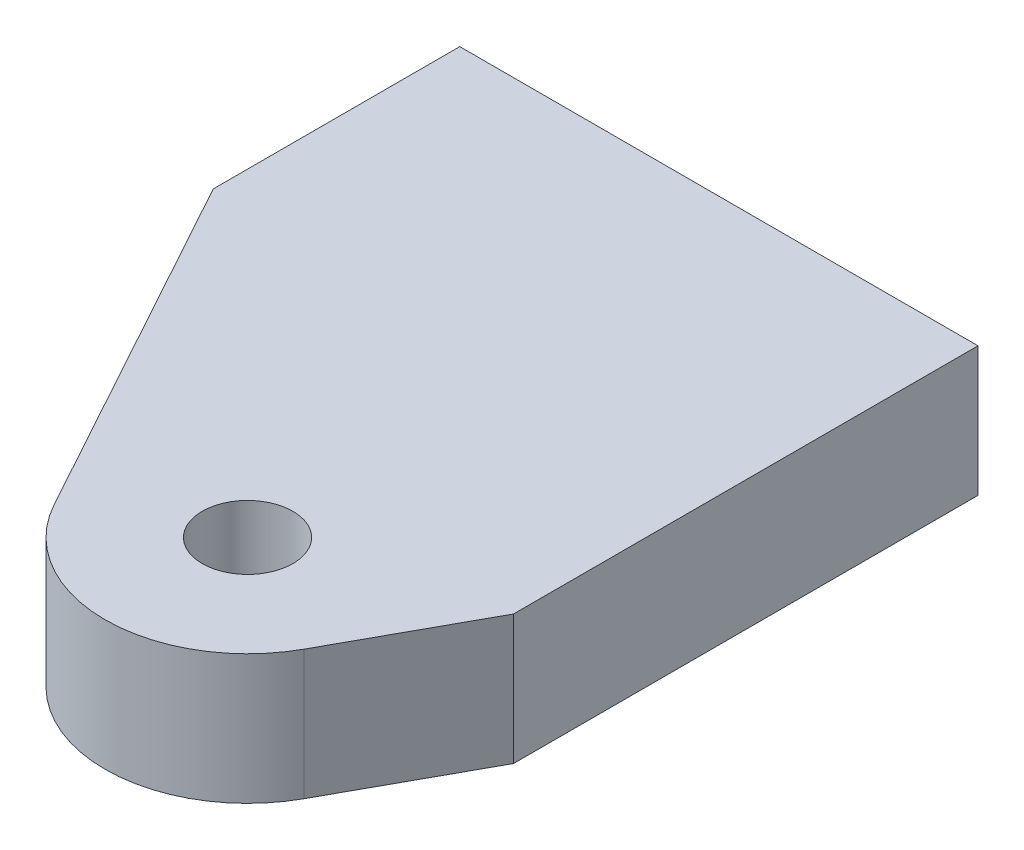
ISO-10303-21;
HEADER;
FILE_DESCRIPTION(('STEP AP214'),'2;1');
FILE_NAME('part.step','',(''),(''),'','','');
FILE_SCHEMA(('AUTOMOTIVE_DESIGN { 1 0 10303 214 1 1 1 1 }'));
ENDSEC;
DATA;
#1=APPLICATION_CONTEXT('core data for automotive mechanical design processes');
#2=APPLICATION_PROTOCOL_DEFINITION('international standard','automotive_design',2000,#1);
#3=PRODUCT_CONTEXT('',#1,'mechanical');
#4=PRODUCT('Part','Part','',(#3));
#5=PRODUCT_RELATED_PRODUCT_CATEGORY('part','',(#4));
#6=PRODUCT_DEFINITION_FORMATION('','',#4);
#7=PRODUCT_DEFINITION_CONTEXT('part definition',#1,'design');
#8=PRODUCT_DEFINITION('design','',#6,#7);
#9=PRODUCT_DEFINITION_SHAPE('','',#8);
#10=(LENGTH_UNIT() NAMED_UNIT(*) SI_UNIT(.MILLI.,.METRE.));
#11=(NAMED_UNIT(*) PLANE_ANGLE_UNIT() SI_UNIT($,.RADIAN.));
#12=(NAMED_UNIT(*) SI_UNIT($,.STERADIAN.) SOLID_ANGLE_UNIT());
#13=UNCERTAINTY_MEASURE_WITH_UNIT(LENGTH_MEASURE(1.E-05),#10,'distance_accuracy_value','');
#14=(GEOMETRIC_REPRESENTATION_CONTEXT(3) GLOBAL_UNCERTAINTY_ASSIGNED_CONTEXT((#13)) GLOBAL_UNIT_ASSIGNED_CONTEXT((#10,
#11,#12)) REPRESENTATION_CONTEXT('',''));
#15=CARTESIAN_POINT('',(0.,0.,0.));
#16=DIRECTION('',(0.,0.,1.));
#17=DIRECTION('',(1.,0.,0.));
#18=AXIS2_PLACEMENT_3D('',#15,#16,#17);
#19=CARTESIAN_POINT('',(2.31000000000003,5.,20.5));
#20=DIRECTION('',(0.,1.,0.));
#21=DIRECTION('',(0.,0.,1.));
#22=AXIS2_PLACEMENT_3D('',#19,#20,#21);
#23=PLANE('',#22);
#24=DIRECTION('',(0.,0.,1.));
#25=VECTOR('',#24,1.);
#26=CARTESIAN_POINT('',(-10.,5.,0.));
#27=LINE('',#26,#25);
#28=CARTESIAN_POINT('',(-10.,5.,0.));
#29=VERTEX_POINT('',#28);
#30=CARTESIAN_POINT('',(-10.,5.,9.51354382946377));
#31=VERTEX_POINT('',#30);
#32=EDGE_CURVE('E129',#29,#31,#27,.T.);
#33=ORIENTED_EDGE('',*,*,#32,.T.);
#34=DIRECTION('',(0.481447756021336,0.,0.876474790408726));
#35=VECTOR('',#34,1.);
#36=CARTESIAN_POINT('',(-10.,5.,9.51354382946377));
#37=LINE('',#36,#35);
#38=CARTESIAN_POINT('',(-2.51061134724796,5.,23.1479626581174));
#39=VERTEX_POINT('',#38);
#40=EDGE_CURVE('E87',#31,#39,#37,.T.);
#41=ORIENTED_EDGE('',*,*,#40,.T.);
#42=CARTESIAN_POINT('',(2.31000000000003,5.,20.5));
#43=DIRECTION('',(0.,1.,0.));
#44=DIRECTION('',(0.,0.,1.));
#45=AXIS2_PLACEMENT_3D('',#42,#43,#44);
#46=CIRCLE('',#45,5.5);
#47=CARTESIAN_POINT('',(7.13061134724803,5.,23.1479626581174));
#48=VERTEX_POINT('',#47);
#49=EDGE_CURVE('E100',#39,#48,#46,.T.);
#50=ORIENTED_EDGE('',*,*,#49,.T.);
#51=DIRECTION('',(0.481447756021337,0.,-0.876474790408726));
#52=VECTOR('',#51,1.);
#53=CARTESIAN_POINT('',(7.13061134724803,5.,23.1479626581174));
#54=LINE('',#53,#52);
#55=CARTESIAN_POINT('',(10.,5.,17.9242456783035));
#56=VERTEX_POINT('',#55);
#57=EDGE_CURVE('E94',#48,#56,#54,.T.);
#58=ORIENTED_EDGE('',*,*,#57,.T.);
#59=DIRECTION('',(0.,0.,-1.));
#60=VECTOR('',#59,1.);
#61=CARTESIAN_POINT('',(10.,5.,17.9242456783035));
#62=LINE('',#61,#60);
#63=CARTESIAN_POINT('',(10.,5.,0.));
#64=VERTEX_POINT('',#63);
#65=EDGE_CURVE('E98',#56,#64,#62,.T.);
#66=ORIENTED_EDGE('',*,*,#65,.T.);
#67=DIRECTION('',(-1.,0.,0.));
#68=VECTOR('',#67,1.);
#69=CARTESIAN_POINT('',(-10.,5.,0.));
#70=LINE('',#69,#68);
#71=EDGE_CURVE('E50',#64,#29,#70,.T.);
#72=ORIENTED_EDGE('',*,*,#71,.T.);
#73=EDGE_LOOP('',(#33,#41,#50,#58,#66,#72));
#74=FACE_BOUND('',#73,.T.);
#75=CARTESIAN_POINT('',(2.31000000000003,5.,20.5));
#76=DIRECTION('',(0.,1.,0.));
#77=DIRECTION('',(0.,0.,1.));
#78=AXIS2_PLACEMENT_3D('',#75,#76,#77);
#79=CIRCLE('',#78,1.75);
#80=CARTESIAN_POINT('',(2.31000000000003,5.,22.25));
#81=VERTEX_POINT('',#80);
#82=EDGE_CURVE('E122',#81,#81,#79,.T.);
#83=ORIENTED_EDGE('',*,*,#82,.F.);
#84=EDGE_LOOP('',(#83));
#85=FACE_BOUND('',#84,.T.);
#86=ADVANCED_FACE('F33',(#74,#85),#23,.T.);
#87=CARTESIAN_POINT('',(2.31000000000003,0.,20.5));
#88=DIRECTION('',(0.,1.,0.));
#89=DIRECTION('',(0.,0.,1.));
#90=AXIS2_PLACEMENT_3D('',#87,#88,#89);
#91=PLANE('',#90);
#92=DIRECTION('',(0.,0.,1.));
#93=VECTOR('',#92,1.);
#94=CARTESIAN_POINT('',(-10.,0.,0.));
#95=LINE('',#94,#93);
#96=CARTESIAN_POINT('',(-10.,0.,0.));
#97=VERTEX_POINT('',#96);
#98=CARTESIAN_POINT('',(-10.,0.,9.51354382946377));
#99=VERTEX_POINT('',#98);
#100=EDGE_CURVE('E118',#97,#99,#95,.T.);
#101=ORIENTED_EDGE('',*,*,#100,.F.);
#102=DIRECTION('',(-1.,0.,0.));
#103=VECTOR('',#102,1.);
#104=CARTESIAN_POINT('',(-10.,0.,0.));
#105=LINE('',#104,#103);
#106=CARTESIAN_POINT('',(10.,0.,0.));
#107=VERTEX_POINT('',#106);
#108=EDGE_CURVE('E79',#107,#97,#105,.T.);
#109=ORIENTED_EDGE('',*,*,#108,.F.);
#110=DIRECTION('',(0.,0.,-1.));
#111=VECTOR('',#110,1.);
#112=CARTESIAN_POINT('',(10.,0.,17.9242456783035));
#113=LINE('',#112,#111);
#114=CARTESIAN_POINT('',(10.,0.,17.9242456783035));
#115=VERTEX_POINT('',#114);
#116=EDGE_CURVE('E73',#115,#107,#113,.T.);
#117=ORIENTED_EDGE('',*,*,#116,.F.);
#118=DIRECTION('',(0.481447756021337,0.,-0.876474790408726));
#119=VECTOR('',#118,1.);
#120=CARTESIAN_POINT('',(7.13061134724803,0.,23.1479626581174));
#121=LINE('',#120,#119);
#122=CARTESIAN_POINT('',(7.13061134724803,0.,23.1479626581174));
#123=VERTEX_POINT('',#122);
#124=EDGE_CURVE('E108',#123,#115,#121,.T.);
#125=ORIENTED_EDGE('',*,*,#124,.F.);
#126=CARTESIAN_POINT('',(2.31000000000003,0.,20.5));
#127=DIRECTION('',(0.,1.,0.));
#128=DIRECTION('',(0.,0.,1.));
#129=AXIS2_PLACEMENT_3D('',#126,#127,#128);
#130=CIRCLE('',#129,5.5);
#131=CARTESIAN_POINT('',(-2.51061134724796,0.,23.1479626581174));
#132=VERTEX_POINT('',#131);
#133=EDGE_CURVE('E124',#132,#123,#130,.T.);
#134=ORIENTED_EDGE('',*,*,#133,.F.);
#135=DIRECTION('',(0.481447756021336,0.,0.876474790408726));
#136=VECTOR('',#135,1.);
#137=CARTESIAN_POINT('',(-10.,0.,9.51354382946377));
#138=LINE('',#137,#136);
#139=EDGE_CURVE('E121',#99,#132,#138,.T.);
#140=ORIENTED_EDGE('',*,*,#139,.F.);
#141=EDGE_LOOP('',(#101,#109,#117,#125,#134,#140));
#142=FACE_BOUND('',#141,.T.);
#143=CARTESIAN_POINT('',(2.31000000000003,0.,20.5));
#144=DIRECTION('',(0.,1.,0.));
#145=DIRECTION('',(0.,0.,1.));
#146=AXIS2_PLACEMENT_3D('',#143,#144,#145);
#147=CIRCLE('',#146,1.75);
#148=CARTESIAN_POINT('',(2.31000000000003,0.,22.25));
#149=VERTEX_POINT('',#148);
#150=EDGE_CURVE('E222',#149,#149,#147,.T.);
#151=ORIENTED_EDGE('',*,*,#150,.T.);
#152=EDGE_LOOP('',(#151));
#153=FACE_BOUND('',#152,.T.);
#154=ADVANCED_FACE('F138',(#142,#153),#91,.F.);
#155=CARTESIAN_POINT('',(-10.,5.,0.));
#156=DIRECTION('',(1.,0.,0.));
#157=DIRECTION('',(0.,0.,-1.));
#158=AXIS2_PLACEMENT_3D('',#155,#156,#157);
#159=PLANE('',#158);
#160=ORIENTED_EDGE('',*,*,#100,.T.);
#161=DIRECTION('',(0.,-1.,0.));
#162=VECTOR('',#161,1.);
#163=CARTESIAN_POINT('',(-10.,5.,9.51354382946377));
#164=LINE('',#163,#162);
#165=EDGE_CURVE('E11',#31,#99,#164,.T.);
#166=ORIENTED_EDGE('',*,*,#165,.F.);
#167=ORIENTED_EDGE('',*,*,#32,.F.);
#168=DIRECTION('',(0.,-1.,0.));
#169=VECTOR('',#168,1.);
#170=CARTESIAN_POINT('',(-10.,5.,0.));
#171=LINE('',#170,#169);
#172=EDGE_CURVE('E114',#29,#97,#171,.T.);
#173=ORIENTED_EDGE('',*,*,#172,.T.);
#174=EDGE_LOOP('',(#160,#166,#167,#173));
#175=FACE_BOUND('',#174,.T.);
#176=ADVANCED_FACE('F35',(#175),#159,.F.);
#177=CARTESIAN_POINT('',(-10.,5.,9.51354382946377));
#178=DIRECTION('',(0.876474790408726,0.,-0.481447756021336));
#179=DIRECTION('',(-0.481447756021336,0.,-0.876474790408726));
#180=AXIS2_PLACEMENT_3D('',#177,#178,#179);
#181=PLANE('',#180);
#182=ORIENTED_EDGE('',*,*,#139,.T.);
#183=DIRECTION('',(0.,-1.,0.));
#184=VECTOR('',#183,1.);
#185=CARTESIAN_POINT('',(-2.51061134724796,5.,23.1479626581174));
#186=LINE('',#185,#184);
#187=EDGE_CURVE('E42',#39,#132,#186,.T.);
#188=ORIENTED_EDGE('',*,*,#187,.F.);
#189=ORIENTED_EDGE('',*,*,#40,.F.);
#190=ORIENTED_EDGE('',*,*,#165,.T.);
#191=EDGE_LOOP('',(#182,#188,#189,#190));
#192=FACE_BOUND('',#191,.T.);
#193=ADVANCED_FACE('F163',(#192),#181,.F.);
#194=CARTESIAN_POINT('',(2.31000000000003,5.,20.5));
#195=DIRECTION('',(0.,-1.,0.));
#196=DIRECTION('',(0.,0.,-1.));
#197=AXIS2_PLACEMENT_3D('',#194,#195,#196);
#198=CYLINDRICAL_SURFACE('',#197,5.5);
#199=ORIENTED_EDGE('',*,*,#133,.T.);
#200=DIRECTION('',(0.,-1.,0.));
#201=VECTOR('',#200,1.);
#202=CARTESIAN_POINT('',(7.13061134724803,5.,23.1479626581174));
#203=LINE('',#202,#201);
#204=EDGE_CURVE('E109',#48,#123,#203,.T.);
#205=ORIENTED_EDGE('',*,*,#204,.F.);
#206=ORIENTED_EDGE('',*,*,#49,.F.);
#207=ORIENTED_EDGE('',*,*,#187,.T.);
#208=EDGE_LOOP('',(#199,#205,#206,#207));
#209=FACE_BOUND('',#208,.T.);
#210=ADVANCED_FACE('F135',(#209),#198,.T.);
#211=CARTESIAN_POINT('',(7.13061134724803,5.,23.1479626581174));
#212=DIRECTION('',(-0.876474790408726,0.,-0.481447756021337));
#213=DIRECTION('',(-0.481447756021337,0.,0.876474790408726));
#214=AXIS2_PLACEMENT_3D('',#211,#212,#213);
#215=PLANE('',#214);
#216=ORIENTED_EDGE('',*,*,#124,.T.);
#217=DIRECTION('',(0.,-1.,0.));
#218=VECTOR('',#217,1.);
#219=CARTESIAN_POINT('',(10.,5.,17.9242456783035));
#220=LINE('',#219,#218);
#221=EDGE_CURVE('E105',#56,#115,#220,.T.);
#222=ORIENTED_EDGE('',*,*,#221,.F.);
#223=ORIENTED_EDGE('',*,*,#57,.F.);
#224=ORIENTED_EDGE('',*,*,#204,.T.);
#225=EDGE_LOOP('',(#216,#222,#223,#224));
#226=FACE_BOUND('',#225,.T.);
#227=ADVANCED_FACE('F106',(#226),#215,.F.);
#228=CARTESIAN_POINT('',(10.,5.,17.9242456783035));
#229=DIRECTION('',(-1.,0.,0.));
#230=DIRECTION('',(0.,0.,1.));
#231=AXIS2_PLACEMENT_3D('',#228,#229,#230);
#232=PLANE('',#231);
#233=ORIENTED_EDGE('',*,*,#116,.T.);
#234=DIRECTION('',(0.,-1.,0.));
#235=VECTOR('',#234,1.);
#236=CARTESIAN_POINT('',(10.,5.,0.));
#237=LINE('',#236,#235);
#238=EDGE_CURVE('E110',#64,#107,#237,.T.);
#239=ORIENTED_EDGE('',*,*,#238,.F.);
#240=ORIENTED_EDGE('',*,*,#65,.F.);
#241=ORIENTED_EDGE('',*,*,#221,.T.);
#242=EDGE_LOOP('',(#233,#239,#240,#241));
#243=FACE_BOUND('',#242,.T.);
#244=ADVANCED_FACE('F112',(#243),#232,.F.);
#245=CARTESIAN_POINT('',(-10.,5.,0.));
#246=DIRECTION('',(0.,0.,1.));
#247=DIRECTION('',(1.,0.,0.));
#248=AXIS2_PLACEMENT_3D('',#245,#246,#247);
#249=PLANE('',#248);
#250=ORIENTED_EDGE('',*,*,#108,.T.);
#251=ORIENTED_EDGE('',*,*,#172,.F.);
#252=ORIENTED_EDGE('',*,*,#71,.F.);
#253=ORIENTED_EDGE('',*,*,#238,.T.);
#254=EDGE_LOOP('',(#250,#251,#252,#253));
#255=FACE_BOUND('',#254,.T.);
#256=ADVANCED_FACE('F143',(#255),#249,.F.);
#257=CARTESIAN_POINT('',(2.31000000000003,5.,20.5));
#258=DIRECTION('',(0.,-1.,0.));
#259=DIRECTION('',(0.,0.,-1.));
#260=AXIS2_PLACEMENT_3D('',#257,#258,#259);
#261=CYLINDRICAL_SURFACE('',#260,1.75);
#262=ORIENTED_EDGE('',*,*,#82,.T.);
#263=EDGE_LOOP('',(#262));
#264=FACE_BOUND('',#263,.T.);
#265=ORIENTED_EDGE('',*,*,#150,.F.);
#266=EDGE_LOOP('',(#265));
#267=FACE_BOUND('',#266,.T.);
#268=ADVANCED_FACE('F145',(#264,#267),#261,.F.);
#269=CLOSED_SHELL('',(#86,#154,#176,#193,#210,#227,#244,#256,#268));
#270=MANIFOLD_SOLID_BREP('B2',#269);
#271=ADVANCED_BREP_SHAPE_REPRESENTATION('',(#18,#270),#14);
#272=SHAPE_DEFINITION_REPRESENTATION(#9,#271);
ENDSEC;
END-ISO-10303-21;
